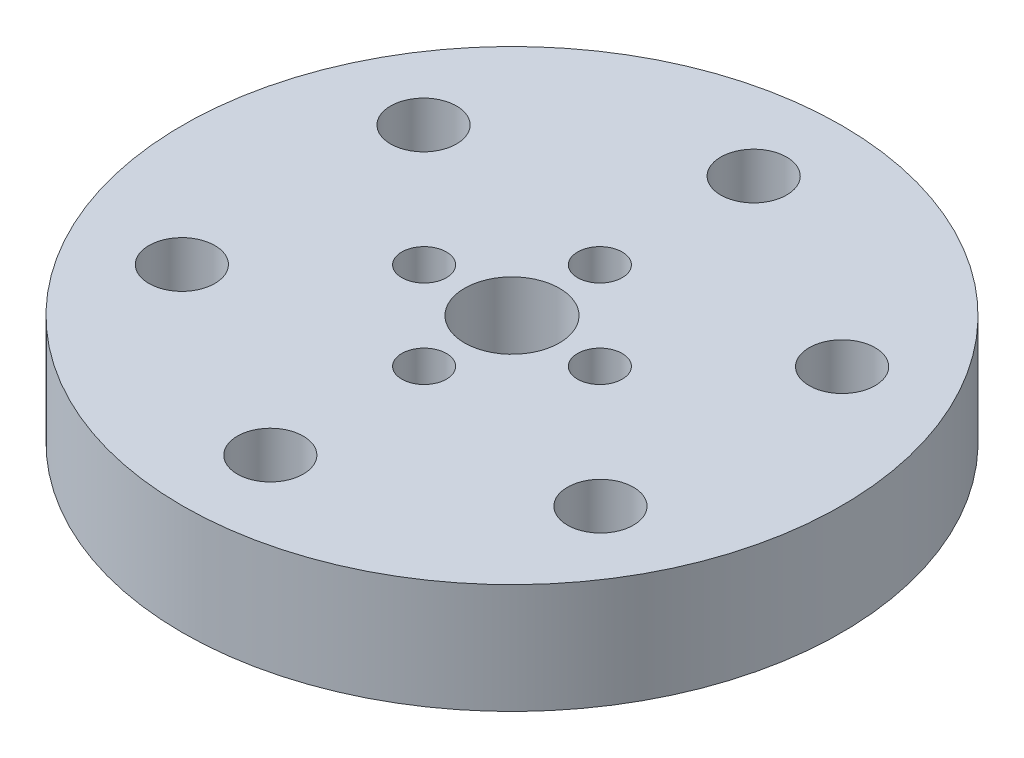
ISO-10303-21;
HEADER;
FILE_DESCRIPTION(('STEP AP214'),'2;1');
FILE_NAME('part.step','',(''),(''),'','','');
FILE_SCHEMA(('AUTOMOTIVE_DESIGN { 1 0 10303 214 1 1 1 1 }'));
ENDSEC;
DATA;
#1=APPLICATION_CONTEXT('core data for automotive mechanical design processes');
#2=APPLICATION_PROTOCOL_DEFINITION('international standard','automotive_design',2000,#1);
#3=PRODUCT_CONTEXT('',#1,'mechanical');
#4=PRODUCT('Part','Part','',(#3));
#5=PRODUCT_RELATED_PRODUCT_CATEGORY('part','',(#4));
#6=PRODUCT_DEFINITION_FORMATION('','',#4);
#7=PRODUCT_DEFINITION_CONTEXT('part definition',#1,'design');
#8=PRODUCT_DEFINITION('design','',#6,#7);
#9=PRODUCT_DEFINITION_SHAPE('','',#8);
#10=(LENGTH_UNIT() NAMED_UNIT(*) SI_UNIT(.MILLI.,.METRE.));
#11=(NAMED_UNIT(*) PLANE_ANGLE_UNIT() SI_UNIT($,.RADIAN.));
#12=(NAMED_UNIT(*) SI_UNIT($,.STERADIAN.) SOLID_ANGLE_UNIT());
#13=UNCERTAINTY_MEASURE_WITH_UNIT(LENGTH_MEASURE(1.E-05),#10,'distance_accuracy_value','');
#14=(GEOMETRIC_REPRESENTATION_CONTEXT(3) GLOBAL_UNCERTAINTY_ASSIGNED_CONTEXT((#13)) GLOBAL_UNIT_ASSIGNED_CONTEXT((#10,
#11,#12)) REPRESENTATION_CONTEXT('',''));
#15=CARTESIAN_POINT('',(0.,0.,0.));
#16=DIRECTION('',(0.,0.,1.));
#17=DIRECTION('',(1.,0.,0.));
#18=AXIS2_PLACEMENT_3D('',#15,#16,#17);
#19=CARTESIAN_POINT('',(0.,10.,0.));
#20=DIRECTION('',(0.,-1.,0.));
#21=DIRECTION('',(0.,0.,-1.));
#22=AXIS2_PLACEMENT_3D('',#19,#20,#21);
#23=CYLINDRICAL_SURFACE('',#22,30.);
#24=CARTESIAN_POINT('',(0.,10.,0.));
#25=DIRECTION('',(0.,1.,0.));
#26=DIRECTION('',(0.,0.,1.));
#27=AXIS2_PLACEMENT_3D('',#24,#25,#26);
#28=CIRCLE('',#27,30.);
#29=CARTESIAN_POINT('',(0.,10.,30.));
#30=VERTEX_POINT('',#29);
#31=EDGE_CURVE('E10',#30,#30,#28,.T.);
#32=ORIENTED_EDGE('',*,*,#31,.F.);
#33=EDGE_LOOP('',(#32));
#34=FACE_BOUND('',#33,.T.);
#35=CARTESIAN_POINT('',(0.,0.,0.));
#36=DIRECTION('',(0.,1.,0.));
#37=DIRECTION('',(0.,0.,1.));
#38=AXIS2_PLACEMENT_3D('',#35,#36,#37);
#39=CIRCLE('',#38,30.);
#40=CARTESIAN_POINT('',(0.,0.,30.));
#41=VERTEX_POINT('',#40);
#42=EDGE_CURVE('E34',#41,#41,#39,.T.);
#43=ORIENTED_EDGE('',*,*,#42,.T.);
#44=EDGE_LOOP('',(#43));
#45=FACE_BOUND('',#44,.T.);
#46=ADVANCED_FACE('F31',(#34,#45),#23,.T.);
#47=CARTESIAN_POINT('',(0.,10.,0.));
#48=DIRECTION('',(0.,1.,0.));
#49=DIRECTION('',(0.,0.,1.));
#50=AXIS2_PLACEMENT_3D('',#47,#48,#49);
#51=PLANE('',#50);
#52=CARTESIAN_POINT('',(8.001,10.,0.));
#53=DIRECTION('',(0.,1.,0.));
#54=DIRECTION('',(0.,0.,1.));
#55=AXIS2_PLACEMENT_3D('',#52,#53,#54);
#56=CIRCLE('',#55,2.032);
#57=CARTESIAN_POINT('',(8.001,10.,2.03200000000008));
#58=VERTEX_POINT('',#57);
#59=EDGE_CURVE('E103',#58,#58,#56,.T.);
#60=ORIENTED_EDGE('',*,*,#59,.F.);
#61=EDGE_LOOP('',(#60));
#62=FACE_BOUND('',#61,.T.);
#63=CARTESIAN_POINT('',(0.,10.,-8.001));
#64=DIRECTION('',(0.,1.,0.));
#65=DIRECTION('',(0.,0.,1.));
#66=AXIS2_PLACEMENT_3D('',#63,#64,#65);
#67=CIRCLE('',#66,2.032);
#68=CARTESIAN_POINT('',(0.,10.,-5.969));
#69=VERTEX_POINT('',#68);
#70=EDGE_CURVE('E97',#69,#69,#67,.T.);
#71=ORIENTED_EDGE('',*,*,#70,.F.);
#72=EDGE_LOOP('',(#71));
#73=FACE_BOUND('',#72,.T.);
#74=CARTESIAN_POINT('',(-8.001,10.,0.));
#75=DIRECTION('',(0.,1.,0.));
#76=DIRECTION('',(0.,0.,1.));
#77=AXIS2_PLACEMENT_3D('',#74,#75,#76);
#78=CIRCLE('',#77,2.032);
#79=CARTESIAN_POINT('',(-8.001,10.,2.03199999999997));
#80=VERTEX_POINT('',#79);
#81=EDGE_CURVE('E91',#80,#80,#78,.T.);
#82=ORIENTED_EDGE('',*,*,#81,.F.);
#83=EDGE_LOOP('',(#82));
#84=FACE_BOUND('',#83,.T.);
#85=CARTESIAN_POINT('',(0.,10.,8.001));
#86=DIRECTION('',(0.,1.,0.));
#87=DIRECTION('',(0.,0.,1.));
#88=AXIS2_PLACEMENT_3D('',#85,#86,#87);
#89=CIRCLE('',#88,2.032);
#90=CARTESIAN_POINT('',(0.,10.,10.033));
#91=VERTEX_POINT('',#90);
#92=EDGE_CURVE('E85',#91,#91,#89,.T.);
#93=ORIENTED_EDGE('',*,*,#92,.F.);
#94=EDGE_LOOP('',(#93));
#95=FACE_BOUND('',#94,.T.);
#96=CARTESIAN_POINT('',(0.,10.,0.));
#97=DIRECTION('',(0.,1.,0.));
#98=DIRECTION('',(0.,0.,1.));
#99=AXIS2_PLACEMENT_3D('',#96,#97,#98);
#100=CIRCLE('',#99,4.318);
#101=CARTESIAN_POINT('',(0.,10.,4.318));
#102=VERTEX_POINT('',#101);
#103=EDGE_CURVE('E79',#102,#102,#100,.T.);
#104=ORIENTED_EDGE('',*,*,#103,.F.);
#105=EDGE_LOOP('',(#104));
#106=FACE_BOUND('',#105,.T.);
#107=CARTESIAN_POINT('',(19.0525588832575,10.,11.0000000000002));
#108=DIRECTION('',(0.,1.,0.));
#109=DIRECTION('',(0.,0.,1.));
#110=AXIS2_PLACEMENT_3D('',#107,#108,#109);
#111=CIRCLE('',#110,3.);
#112=CARTESIAN_POINT('',(19.0525588832575,10.,14.0000000000002));
#113=VERTEX_POINT('',#112);
#114=EDGE_CURVE('E73',#113,#113,#111,.T.);
#115=ORIENTED_EDGE('',*,*,#114,.F.);
#116=EDGE_LOOP('',(#115));
#117=FACE_BOUND('',#116,.T.);
#118=CARTESIAN_POINT('',(19.0525588832577,10.,-10.9999999999998));
#119=DIRECTION('',(0.,1.,0.));
#120=DIRECTION('',(0.,0.,1.));
#121=AXIS2_PLACEMENT_3D('',#118,#119,#120);
#122=CIRCLE('',#121,3.);
#123=CARTESIAN_POINT('',(19.0525588832577,10.,-7.99999999999983));
#124=VERTEX_POINT('',#123);
#125=EDGE_CURVE('E67',#124,#124,#122,.T.);
#126=ORIENTED_EDGE('',*,*,#125,.F.);
#127=EDGE_LOOP('',(#126));
#128=FACE_BOUND('',#127,.T.);
#129=CARTESIAN_POINT('',(1.53625178909098E-13,10.,-22.));
#130=DIRECTION('',(0.,1.,0.));
#131=DIRECTION('',(0.,0.,1.));
#132=AXIS2_PLACEMENT_3D('',#129,#130,#131);
#133=CIRCLE('',#132,3.);
#134=CARTESIAN_POINT('',(1.53625178909098E-13,10.,-19.));
#135=VERTEX_POINT('',#134);
#136=EDGE_CURVE('E61',#135,#135,#133,.T.);
#137=ORIENTED_EDGE('',*,*,#136,.F.);
#138=EDGE_LOOP('',(#137));
#139=FACE_BOUND('',#138,.T.);
#140=CARTESIAN_POINT('',(-19.0525588832576,10.,-11.0000000000001));
#141=DIRECTION('',(0.,1.,0.));
#142=DIRECTION('',(0.,0.,1.));
#143=AXIS2_PLACEMENT_3D('',#140,#141,#142);
#144=CIRCLE('',#143,3.);
#145=CARTESIAN_POINT('',(-19.0525588832576,10.,-8.00000000000009));
#146=VERTEX_POINT('',#145);
#147=EDGE_CURVE('E55',#146,#146,#144,.T.);
#148=ORIENTED_EDGE('',*,*,#147,.F.);
#149=EDGE_LOOP('',(#148));
#150=FACE_BOUND('',#149,.T.);
#151=CARTESIAN_POINT('',(-19.0525588832577,10.,11.));
#152=DIRECTION('',(0.,1.,0.));
#153=DIRECTION('',(0.,0.,1.));
#154=AXIS2_PLACEMENT_3D('',#151,#152,#153);
#155=CIRCLE('',#154,3.);
#156=CARTESIAN_POINT('',(-19.0525588832577,10.,14.));
#157=VERTEX_POINT('',#156);
#158=EDGE_CURVE('E49',#157,#157,#155,.T.);
#159=ORIENTED_EDGE('',*,*,#158,.F.);
#160=EDGE_LOOP('',(#159));
#161=FACE_BOUND('',#160,.T.);
#162=CARTESIAN_POINT('',(0.,10.,22.));
#163=DIRECTION('',(0.,1.,0.));
#164=DIRECTION('',(0.,0.,1.));
#165=AXIS2_PLACEMENT_3D('',#162,#163,#164);
#166=CIRCLE('',#165,3.);
#167=CARTESIAN_POINT('',(0.,10.,25.));
#168=VERTEX_POINT('',#167);
#169=EDGE_CURVE('E43',#168,#168,#166,.T.);
#170=ORIENTED_EDGE('',*,*,#169,.F.);
#171=EDGE_LOOP('',(#170));
#172=FACE_BOUND('',#171,.T.);
#173=ORIENTED_EDGE('',*,*,#31,.T.);
#174=EDGE_LOOP('',(#173));
#175=FACE_BOUND('',#174,.T.);
#176=ADVANCED_FACE('F119',(#62,#73,#84,#95,#106,#117,#128,#139,#150,#161,#172,#175),#51,.T.);
#177=CARTESIAN_POINT('',(0.,0.,0.));
#178=DIRECTION('',(0.,1.,0.));
#179=DIRECTION('',(0.,0.,1.));
#180=AXIS2_PLACEMENT_3D('',#177,#178,#179);
#181=PLANE('',#180);
#182=CARTESIAN_POINT('',(8.001,0.,0.));
#183=DIRECTION('',(0.,1.,0.));
#184=DIRECTION('',(0.,0.,1.));
#185=AXIS2_PLACEMENT_3D('',#182,#183,#184);
#186=CIRCLE('',#185,2.032);
#187=CARTESIAN_POINT('',(8.001,0.,2.03200000000008));
#188=VERTEX_POINT('',#187);
#189=EDGE_CURVE('E100',#188,#188,#186,.T.);
#190=ORIENTED_EDGE('',*,*,#189,.T.);
#191=EDGE_LOOP('',(#190));
#192=FACE_BOUND('',#191,.T.);
#193=CARTESIAN_POINT('',(0.,0.,-8.001));
#194=DIRECTION('',(0.,1.,0.));
#195=DIRECTION('',(0.,0.,1.));
#196=AXIS2_PLACEMENT_3D('',#193,#194,#195);
#197=CIRCLE('',#196,2.032);
#198=CARTESIAN_POINT('',(0.,0.,-5.969));
#199=VERTEX_POINT('',#198);
#200=EDGE_CURVE('E94',#199,#199,#197,.T.);
#201=ORIENTED_EDGE('',*,*,#200,.T.);
#202=EDGE_LOOP('',(#201));
#203=FACE_BOUND('',#202,.T.);
#204=CARTESIAN_POINT('',(-8.001,0.,0.));
#205=DIRECTION('',(0.,1.,0.));
#206=DIRECTION('',(0.,0.,1.));
#207=AXIS2_PLACEMENT_3D('',#204,#205,#206);
#208=CIRCLE('',#207,2.032);
#209=CARTESIAN_POINT('',(-8.001,0.,2.03199999999997));
#210=VERTEX_POINT('',#209);
#211=EDGE_CURVE('E88',#210,#210,#208,.T.);
#212=ORIENTED_EDGE('',*,*,#211,.T.);
#213=EDGE_LOOP('',(#212));
#214=FACE_BOUND('',#213,.T.);
#215=CARTESIAN_POINT('',(0.,0.,8.001));
#216=DIRECTION('',(0.,1.,0.));
#217=DIRECTION('',(0.,0.,1.));
#218=AXIS2_PLACEMENT_3D('',#215,#216,#217);
#219=CIRCLE('',#218,2.032);
#220=CARTESIAN_POINT('',(0.,0.,10.033));
#221=VERTEX_POINT('',#220);
#222=EDGE_CURVE('E82',#221,#221,#219,.T.);
#223=ORIENTED_EDGE('',*,*,#222,.T.);
#224=EDGE_LOOP('',(#223));
#225=FACE_BOUND('',#224,.T.);
#226=CARTESIAN_POINT('',(0.,0.,0.));
#227=DIRECTION('',(0.,1.,0.));
#228=DIRECTION('',(0.,0.,1.));
#229=AXIS2_PLACEMENT_3D('',#226,#227,#228);
#230=CIRCLE('',#229,4.318);
#231=CARTESIAN_POINT('',(0.,0.,4.318));
#232=VERTEX_POINT('',#231);
#233=EDGE_CURVE('E76',#232,#232,#230,.T.);
#234=ORIENTED_EDGE('',*,*,#233,.T.);
#235=EDGE_LOOP('',(#234));
#236=FACE_BOUND('',#235,.T.);
#237=CARTESIAN_POINT('',(19.0525588832575,0.,11.0000000000002));
#238=DIRECTION('',(0.,1.,0.));
#239=DIRECTION('',(0.,0.,1.));
#240=AXIS2_PLACEMENT_3D('',#237,#238,#239);
#241=CIRCLE('',#240,3.);
#242=CARTESIAN_POINT('',(19.0525588832575,0.,14.0000000000002));
#243=VERTEX_POINT('',#242);
#244=EDGE_CURVE('E70',#243,#243,#241,.T.);
#245=ORIENTED_EDGE('',*,*,#244,.T.);
#246=EDGE_LOOP('',(#245));
#247=FACE_BOUND('',#246,.T.);
#248=CARTESIAN_POINT('',(19.0525588832577,0.,-10.9999999999998));
#249=DIRECTION('',(0.,1.,0.));
#250=DIRECTION('',(0.,0.,1.));
#251=AXIS2_PLACEMENT_3D('',#248,#249,#250);
#252=CIRCLE('',#251,3.);
#253=CARTESIAN_POINT('',(19.0525588832577,0.,-7.99999999999983));
#254=VERTEX_POINT('',#253);
#255=EDGE_CURVE('E64',#254,#254,#252,.T.);
#256=ORIENTED_EDGE('',*,*,#255,.T.);
#257=EDGE_LOOP('',(#256));
#258=FACE_BOUND('',#257,.T.);
#259=CARTESIAN_POINT('',(1.53625178909098E-13,0.,-22.));
#260=DIRECTION('',(0.,1.,0.));
#261=DIRECTION('',(0.,0.,1.));
#262=AXIS2_PLACEMENT_3D('',#259,#260,#261);
#263=CIRCLE('',#262,3.);
#264=CARTESIAN_POINT('',(1.53625178909098E-13,0.,-19.));
#265=VERTEX_POINT('',#264);
#266=EDGE_CURVE('E58',#265,#265,#263,.T.);
#267=ORIENTED_EDGE('',*,*,#266,.T.);
#268=EDGE_LOOP('',(#267));
#269=FACE_BOUND('',#268,.T.);
#270=CARTESIAN_POINT('',(-19.0525588832576,0.,-11.0000000000001));
#271=DIRECTION('',(0.,1.,0.));
#272=DIRECTION('',(0.,0.,1.));
#273=AXIS2_PLACEMENT_3D('',#270,#271,#272);
#274=CIRCLE('',#273,3.);
#275=CARTESIAN_POINT('',(-19.0525588832576,0.,-8.00000000000009));
#276=VERTEX_POINT('',#275);
#277=EDGE_CURVE('E52',#276,#276,#274,.T.);
#278=ORIENTED_EDGE('',*,*,#277,.T.);
#279=EDGE_LOOP('',(#278));
#280=FACE_BOUND('',#279,.T.);
#281=CARTESIAN_POINT('',(-19.0525588832577,0.,11.));
#282=DIRECTION('',(0.,1.,0.));
#283=DIRECTION('',(0.,0.,1.));
#284=AXIS2_PLACEMENT_3D('',#281,#282,#283);
#285=CIRCLE('',#284,3.);
#286=CARTESIAN_POINT('',(-19.0525588832577,0.,14.));
#287=VERTEX_POINT('',#286);
#288=EDGE_CURVE('E46',#287,#287,#285,.T.);
#289=ORIENTED_EDGE('',*,*,#288,.T.);
#290=EDGE_LOOP('',(#289));
#291=FACE_BOUND('',#290,.T.);
#292=CARTESIAN_POINT('',(0.,0.,22.));
#293=DIRECTION('',(0.,1.,0.));
#294=DIRECTION('',(0.,0.,1.));
#295=AXIS2_PLACEMENT_3D('',#292,#293,#294);
#296=CIRCLE('',#295,3.);
#297=CARTESIAN_POINT('',(0.,0.,25.));
#298=VERTEX_POINT('',#297);
#299=EDGE_CURVE('E41',#298,#298,#296,.T.);
#300=ORIENTED_EDGE('',*,*,#299,.T.);
#301=EDGE_LOOP('',(#300));
#302=FACE_BOUND('',#301,.T.);
#303=ORIENTED_EDGE('',*,*,#42,.F.);
#304=EDGE_LOOP('',(#303));
#305=FACE_BOUND('',#304,.T.);
#306=ADVANCED_FACE('F109',(#192,#203,#214,#225,#236,#247,#258,#269,#280,#291,#302,#305),#181,.F.);
#307=CARTESIAN_POINT('',(0.,0.,22.));
#308=DIRECTION('',(0.,1.,0.));
#309=DIRECTION('',(0.,0.,1.));
#310=AXIS2_PLACEMENT_3D('',#307,#308,#309);
#311=CYLINDRICAL_SURFACE('',#310,3.);
#312=ORIENTED_EDGE('',*,*,#299,.F.);
#313=EDGE_LOOP('',(#312));
#314=FACE_BOUND('',#313,.T.);
#315=ORIENTED_EDGE('',*,*,#169,.T.);
#316=EDGE_LOOP('',(#315));
#317=FACE_BOUND('',#316,.T.);
#318=ADVANCED_FACE('F143',(#314,#317),#311,.F.);
#319=CARTESIAN_POINT('',(-19.0525588832577,0.,11.));
#320=DIRECTION('',(0.,1.,0.));
#321=DIRECTION('',(0.,0.,1.));
#322=AXIS2_PLACEMENT_3D('',#319,#320,#321);
#323=CYLINDRICAL_SURFACE('',#322,3.);
#324=ORIENTED_EDGE('',*,*,#288,.F.);
#325=EDGE_LOOP('',(#324));
#326=FACE_BOUND('',#325,.T.);
#327=ORIENTED_EDGE('',*,*,#158,.T.);
#328=EDGE_LOOP('',(#327));
#329=FACE_BOUND('',#328,.T.);
#330=ADVANCED_FACE('F145',(#326,#329),#323,.F.);
#331=CARTESIAN_POINT('',(-19.0525588832576,0.,-11.0000000000001));
#332=DIRECTION('',(0.,1.,0.));
#333=DIRECTION('',(0.,0.,1.));
#334=AXIS2_PLACEMENT_3D('',#331,#332,#333);
#335=CYLINDRICAL_SURFACE('',#334,3.);
#336=ORIENTED_EDGE('',*,*,#277,.F.);
#337=EDGE_LOOP('',(#336));
#338=FACE_BOUND('',#337,.T.);
#339=ORIENTED_EDGE('',*,*,#147,.T.);
#340=EDGE_LOOP('',(#339));
#341=FACE_BOUND('',#340,.T.);
#342=ADVANCED_FACE('F152',(#338,#341),#335,.F.);
#343=CARTESIAN_POINT('',(1.53625178909098E-13,0.,-22.));
#344=DIRECTION('',(0.,1.,0.));
#345=DIRECTION('',(0.,0.,1.));
#346=AXIS2_PLACEMENT_3D('',#343,#344,#345);
#347=CYLINDRICAL_SURFACE('',#346,3.);
#348=ORIENTED_EDGE('',*,*,#266,.F.);
#349=EDGE_LOOP('',(#348));
#350=FACE_BOUND('',#349,.T.);
#351=ORIENTED_EDGE('',*,*,#136,.T.);
#352=EDGE_LOOP('',(#351));
#353=FACE_BOUND('',#352,.T.);
#354=ADVANCED_FACE('F233',(#350,#353),#347,.F.);
#355=CARTESIAN_POINT('',(19.0525588832577,0.,-10.9999999999998));
#356=DIRECTION('',(0.,1.,0.));
#357=DIRECTION('',(0.,0.,1.));
#358=AXIS2_PLACEMENT_3D('',#355,#356,#357);
#359=CYLINDRICAL_SURFACE('',#358,3.);
#360=ORIENTED_EDGE('',*,*,#255,.F.);
#361=EDGE_LOOP('',(#360));
#362=FACE_BOUND('',#361,.T.);
#363=ORIENTED_EDGE('',*,*,#125,.T.);
#364=EDGE_LOOP('',(#363));
#365=FACE_BOUND('',#364,.T.);
#366=ADVANCED_FACE('F229',(#362,#365),#359,.F.);
#367=CARTESIAN_POINT('',(19.0525588832575,0.,11.0000000000002));
#368=DIRECTION('',(0.,1.,0.));
#369=DIRECTION('',(0.,0.,1.));
#370=AXIS2_PLACEMENT_3D('',#367,#368,#369);
#371=CYLINDRICAL_SURFACE('',#370,3.);
#372=ORIENTED_EDGE('',*,*,#244,.F.);
#373=EDGE_LOOP('',(#372));
#374=FACE_BOUND('',#373,.T.);
#375=ORIENTED_EDGE('',*,*,#114,.T.);
#376=EDGE_LOOP('',(#375));
#377=FACE_BOUND('',#376,.T.);
#378=ADVANCED_FACE('F184',(#374,#377),#371,.F.);
#379=CARTESIAN_POINT('',(0.,0.,0.));
#380=DIRECTION('',(0.,1.,0.));
#381=DIRECTION('',(0.,0.,1.));
#382=AXIS2_PLACEMENT_3D('',#379,#380,#381);
#383=CYLINDRICAL_SURFACE('',#382,4.318);
#384=ORIENTED_EDGE('',*,*,#233,.F.);
#385=EDGE_LOOP('',(#384));
#386=FACE_BOUND('',#385,.T.);
#387=ORIENTED_EDGE('',*,*,#103,.T.);
#388=EDGE_LOOP('',(#387));
#389=FACE_BOUND('',#388,.T.);
#390=ADVANCED_FACE('F178',(#386,#389),#383,.F.);
#391=CARTESIAN_POINT('',(0.,0.,8.001));
#392=DIRECTION('',(0.,1.,0.));
#393=DIRECTION('',(0.,0.,1.));
#394=AXIS2_PLACEMENT_3D('',#391,#392,#393);
#395=CYLINDRICAL_SURFACE('',#394,2.032);
#396=ORIENTED_EDGE('',*,*,#222,.F.);
#397=EDGE_LOOP('',(#396));
#398=FACE_BOUND('',#397,.T.);
#399=ORIENTED_EDGE('',*,*,#92,.T.);
#400=EDGE_LOOP('',(#399));
#401=FACE_BOUND('',#400,.T.);
#402=ADVANCED_FACE('F183',(#398,#401),#395,.F.);
#403=CARTESIAN_POINT('',(-8.001,0.,0.));
#404=DIRECTION('',(0.,1.,0.));
#405=DIRECTION('',(0.,0.,1.));
#406=AXIS2_PLACEMENT_3D('',#403,#404,#405);
#407=CYLINDRICAL_SURFACE('',#406,2.032);
#408=ORIENTED_EDGE('',*,*,#211,.F.);
#409=EDGE_LOOP('',(#408));
#410=FACE_BOUND('',#409,.T.);
#411=ORIENTED_EDGE('',*,*,#81,.T.);
#412=EDGE_LOOP('',(#411));
#413=FACE_BOUND('',#412,.T.);
#414=ADVANCED_FACE('F196',(#410,#413),#407,.F.);
#415=CARTESIAN_POINT('',(0.,0.,-8.001));
#416=DIRECTION('',(0.,1.,0.));
#417=DIRECTION('',(0.,0.,1.));
#418=AXIS2_PLACEMENT_3D('',#415,#416,#417);
#419=CYLINDRICAL_SURFACE('',#418,2.032);
#420=ORIENTED_EDGE('',*,*,#200,.F.);
#421=EDGE_LOOP('',(#420));
#422=FACE_BOUND('',#421,.T.);
#423=ORIENTED_EDGE('',*,*,#70,.T.);
#424=EDGE_LOOP('',(#423));
#425=FACE_BOUND('',#424,.T.);
#426=ADVANCED_FACE('F115',(#422,#425),#419,.F.);
#427=CARTESIAN_POINT('',(8.001,0.,0.));
#428=DIRECTION('',(0.,1.,0.));
#429=DIRECTION('',(0.,0.,1.));
#430=AXIS2_PLACEMENT_3D('',#427,#428,#429);
#431=CYLINDRICAL_SURFACE('',#430,2.032);
#432=ORIENTED_EDGE('',*,*,#189,.F.);
#433=EDGE_LOOP('',(#432));
#434=FACE_BOUND('',#433,.T.);
#435=ORIENTED_EDGE('',*,*,#59,.T.);
#436=EDGE_LOOP('',(#435));
#437=FACE_BOUND('',#436,.T.);
#438=ADVANCED_FACE('F112',(#434,#437),#431,.F.);
#439=CLOSED_SHELL('',(#46,#176,#306,#318,#330,#342,#354,#366,#378,#390,#402,#414,#426,#438));
#440=MANIFOLD_SOLID_BREP('B2',#439);
#441=ADVANCED_BREP_SHAPE_REPRESENTATION('',(#18,#440),#14);
#442=SHAPE_DEFINITION_REPRESENTATION(#9,#441);
ENDSEC;
END-ISO-10303-21;
